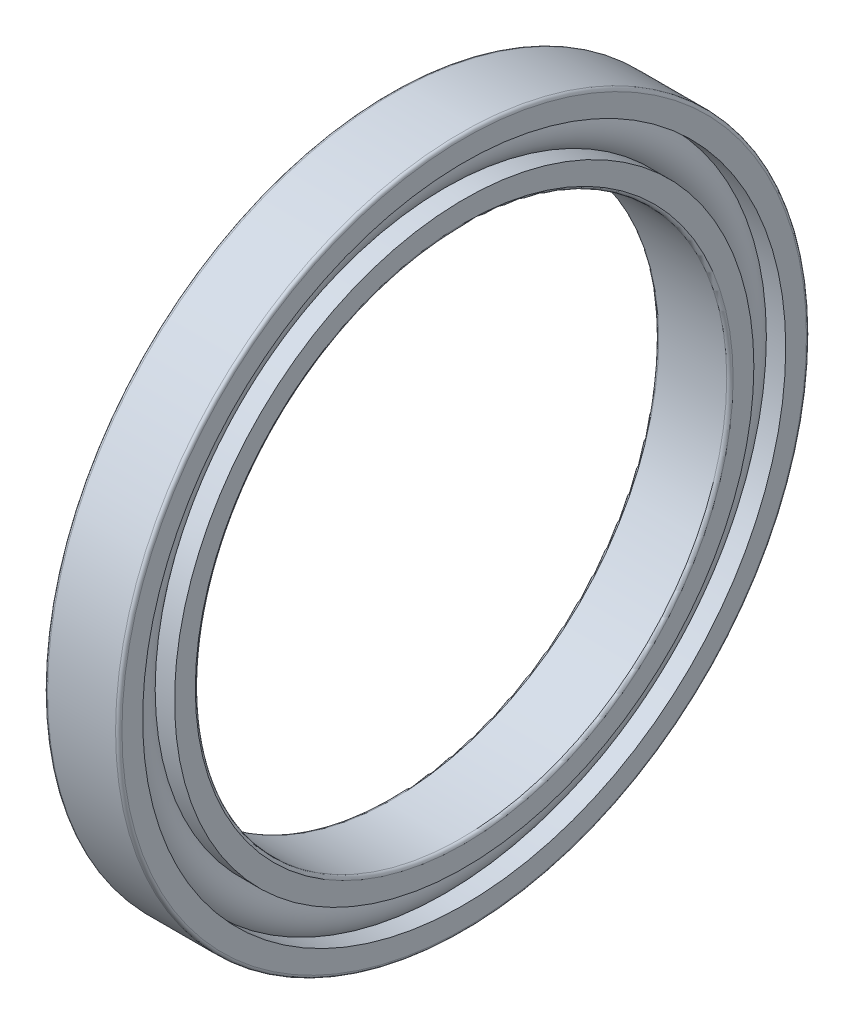
ISO-10303-21;
HEADER;
FILE_DESCRIPTION(('STEP AP214'),'2;1');
FILE_NAME('part.step','',(''),(''),'','','');
FILE_SCHEMA(('AUTOMOTIVE_DESIGN { 1 0 10303 214 1 1 1 1 }'));
ENDSEC;
DATA;
#1=APPLICATION_CONTEXT('core data for automotive mechanical design processes');
#2=APPLICATION_PROTOCOL_DEFINITION('international standard','automotive_design',2000,#1);
#3=PRODUCT_CONTEXT('',#1,'mechanical');
#4=PRODUCT('Part','Part','',(#3));
#5=PRODUCT_RELATED_PRODUCT_CATEGORY('part','',(#4));
#6=PRODUCT_DEFINITION_FORMATION('','',#4);
#7=PRODUCT_DEFINITION_CONTEXT('part definition',#1,'design');
#8=PRODUCT_DEFINITION('design','',#6,#7);
#9=PRODUCT_DEFINITION_SHAPE('','',#8);
#10=(LENGTH_UNIT() NAMED_UNIT(*) SI_UNIT(.MILLI.,.METRE.));
#11=(NAMED_UNIT(*) PLANE_ANGLE_UNIT() SI_UNIT($,.RADIAN.));
#12=(NAMED_UNIT(*) SI_UNIT($,.STERADIAN.) SOLID_ANGLE_UNIT());
#13=UNCERTAINTY_MEASURE_WITH_UNIT(LENGTH_MEASURE(1.E-05),#10,'distance_accuracy_value','');
#14=(GEOMETRIC_REPRESENTATION_CONTEXT(3) GLOBAL_UNCERTAINTY_ASSIGNED_CONTEXT((#13)) GLOBAL_UNIT_ASSIGNED_CONTEXT((#10,
#11,#12)) REPRESENTATION_CONTEXT('',''));
#15=CARTESIAN_POINT('',(0.,0.,0.));
#16=DIRECTION('',(0.,0.,1.));
#17=DIRECTION('',(1.,0.,0.));
#18=AXIS2_PLACEMENT_3D('',#15,#16,#17);
#19=CARTESIAN_POINT('',(0.,0.,0.));
#20=DIRECTION('',(-1.,0.,0.));
#21=DIRECTION('',(0.,0.,1.));
#22=AXIS2_PLACEMENT_3D('',#19,#20,#21);
#23=TOROIDAL_SURFACE('',#22,28.75,2.25);
#24=CARTESIAN_POINT('',(1.67705098312484,0.,0.));
#25=DIRECTION('',(-1.,0.,0.));
#26=DIRECTION('',(0.,0.,1.));
#27=AXIS2_PLACEMENT_3D('',#24,#25,#26);
#28=CIRCLE('',#27,30.25);
#29=CARTESIAN_POINT('',(1.67705098312484,0.,30.25));
#30=VERTEX_POINT('',#29);
#31=EDGE_CURVE('E35',#30,#30,#28,.F.);
#32=ORIENTED_EDGE('',*,*,#31,.T.);
#33=EDGE_LOOP('',(#32));
#34=FACE_BOUND('',#33,.T.);
#35=CARTESIAN_POINT('',(1.67705098312484,0.,0.));
#36=DIRECTION('',(-1.,0.,0.));
#37=DIRECTION('',(0.,0.,1.));
#38=AXIS2_PLACEMENT_3D('',#35,#36,#37);
#39=CIRCLE('',#38,27.25);
#40=CARTESIAN_POINT('',(1.67705098312484,0.,27.25));
#41=VERTEX_POINT('',#40);
#42=EDGE_CURVE('E10',#41,#41,#39,.T.);
#43=ORIENTED_EDGE('',*,*,#42,.T.);
#44=EDGE_LOOP('',(#43));
#45=FACE_BOUND('',#44,.T.);
#46=ADVANCED_FACE('F31',(#34,#45),#23,.T.);
#47=CARTESIAN_POINT('',(-20.6375,0.,0.));
#48=DIRECTION('',(1.,0.,0.));
#49=DIRECTION('',(0.,0.,-1.));
#50=AXIS2_PLACEMENT_3D('',#47,#48,#49);
#51=CYLINDRICAL_SURFACE('',#50,27.25);
#52=CARTESIAN_POINT('',(3.5,0.,0.));
#53=DIRECTION('',(1.,0.,0.));
#54=DIRECTION('',(0.,0.,-1.));
#55=AXIS2_PLACEMENT_3D('',#52,#53,#54);
#56=CIRCLE('',#55,27.25);
#57=CARTESIAN_POINT('',(3.5,0.,-27.25));
#58=VERTEX_POINT('',#57);
#59=EDGE_CURVE('E44',#58,#58,#56,.T.);
#60=ORIENTED_EDGE('',*,*,#59,.F.);
#61=EDGE_LOOP('',(#60));
#62=FACE_BOUND('',#61,.T.);
#63=ORIENTED_EDGE('',*,*,#42,.F.);
#64=EDGE_LOOP('',(#63));
#65=FACE_BOUND('',#64,.T.);
#66=ADVANCED_FACE('F83',(#62,#65),#51,.T.);
#67=CARTESIAN_POINT('',(-20.6375,0.,0.));
#68=DIRECTION('',(1.,0.,0.));
#69=DIRECTION('',(0.,0.,-1.));
#70=AXIS2_PLACEMENT_3D('',#67,#68,#69);
#71=CYLINDRICAL_SURFACE('',#70,27.25);
#72=CARTESIAN_POINT('',(-3.5,0.,0.));
#73=DIRECTION('',(1.,0.,0.));
#74=DIRECTION('',(0.,0.,-1.));
#75=AXIS2_PLACEMENT_3D('',#72,#73,#74);
#76=CIRCLE('',#75,27.25);
#77=CARTESIAN_POINT('',(-3.5,0.,-27.25));
#78=VERTEX_POINT('',#77);
#79=EDGE_CURVE('E53',#78,#78,#76,.T.);
#80=ORIENTED_EDGE('',*,*,#79,.T.);
#81=EDGE_LOOP('',(#80));
#82=FACE_BOUND('',#81,.T.);
#83=CARTESIAN_POINT('',(-1.67705098312484,0.,0.));
#84=DIRECTION('',(1.,0.,0.));
#85=DIRECTION('',(0.,0.,-1.));
#86=AXIS2_PLACEMENT_3D('',#83,#84,#85);
#87=CIRCLE('',#86,27.25);
#88=CARTESIAN_POINT('',(-1.67705098312484,0.,-27.25));
#89=VERTEX_POINT('',#88);
#90=EDGE_CURVE('E39',#89,#89,#87,.T.);
#91=ORIENTED_EDGE('',*,*,#90,.F.);
#92=EDGE_LOOP('',(#91));
#93=FACE_BOUND('',#92,.T.);
#94=ADVANCED_FACE('F86',(#82,#93),#71,.T.);
#95=CARTESIAN_POINT('',(3.5,25.3,0.));
#96=DIRECTION('',(1.,0.,0.));
#97=DIRECTION('',(0.,0.,-1.));
#98=AXIS2_PLACEMENT_3D('',#95,#96,#97);
#99=PLANE('',#98);
#100=ORIENTED_EDGE('',*,*,#59,.T.);
#101=EDGE_LOOP('',(#100));
#102=FACE_BOUND('',#101,.T.);
#103=CARTESIAN_POINT('',(3.5,0.,0.));
#104=DIRECTION('',(1.,0.,0.));
#105=DIRECTION('',(0.,0.,-1.));
#106=AXIS2_PLACEMENT_3D('',#103,#104,#105);
#107=CIRCLE('',#106,25.3);
#108=CARTESIAN_POINT('',(3.5,0.,-25.3));
#109=VERTEX_POINT('',#108);
#110=EDGE_CURVE('E75',#109,#109,#107,.T.);
#111=ORIENTED_EDGE('',*,*,#110,.F.);
#112=EDGE_LOOP('',(#111));
#113=FACE_BOUND('',#112,.T.);
#114=ADVANCED_FACE('F80',(#102,#113),#99,.T.);
#115=CARTESIAN_POINT('',(3.2,0.,0.));
#116=DIRECTION('',(1.,0.,0.));
#117=DIRECTION('',(0.,0.,-1.));
#118=AXIS2_PLACEMENT_3D('',#115,#116,#117);
#119=TOROIDAL_SURFACE('',#118,25.3,0.300000000000001);
#120=ORIENTED_EDGE('',*,*,#110,.T.);
#121=EDGE_LOOP('',(#120));
#122=FACE_BOUND('',#121,.T.);
#123=CARTESIAN_POINT('',(3.2,0.,0.));
#124=DIRECTION('',(1.,0.,0.));
#125=DIRECTION('',(0.,0.,-1.));
#126=AXIS2_PLACEMENT_3D('',#123,#124,#125);
#127=CIRCLE('',#126,25.);
#128=CARTESIAN_POINT('',(3.2,0.,-25.));
#129=VERTEX_POINT('',#128);
#130=EDGE_CURVE('E72',#129,#129,#127,.T.);
#131=ORIENTED_EDGE('',*,*,#130,.F.);
#132=EDGE_LOOP('',(#131));
#133=FACE_BOUND('',#132,.T.);
#134=ADVANCED_FACE('F97',(#122,#133),#119,.T.);
#135=CARTESIAN_POINT('',(-20.6375,0.,0.));
#136=DIRECTION('',(1.,0.,0.));
#137=DIRECTION('',(0.,0.,-1.));
#138=AXIS2_PLACEMENT_3D('',#135,#136,#137);
#139=CYLINDRICAL_SURFACE('',#138,25.);
#140=ORIENTED_EDGE('',*,*,#130,.T.);
#141=EDGE_LOOP('',(#140));
#142=FACE_BOUND('',#141,.T.);
#143=CARTESIAN_POINT('',(-3.2,0.,0.));
#144=DIRECTION('',(1.,0.,0.));
#145=DIRECTION('',(0.,0.,-1.));
#146=AXIS2_PLACEMENT_3D('',#143,#144,#145);
#147=CIRCLE('',#146,25.);
#148=CARTESIAN_POINT('',(-3.2,0.,-25.));
#149=VERTEX_POINT('',#148);
#150=EDGE_CURVE('E69',#149,#149,#147,.T.);
#151=ORIENTED_EDGE('',*,*,#150,.F.);
#152=EDGE_LOOP('',(#151));
#153=FACE_BOUND('',#152,.T.);
#154=ADVANCED_FACE('F100',(#142,#153),#139,.F.);
#155=CARTESIAN_POINT('',(-3.2,0.,0.));
#156=DIRECTION('',(1.,0.,0.));
#157=DIRECTION('',(0.,0.,-1.));
#158=AXIS2_PLACEMENT_3D('',#155,#156,#157);
#159=TOROIDAL_SURFACE('',#158,25.3,0.300000000000001);
#160=ORIENTED_EDGE('',*,*,#150,.T.);
#161=EDGE_LOOP('',(#160));
#162=FACE_BOUND('',#161,.T.);
#163=CARTESIAN_POINT('',(-3.5,0.,0.));
#164=DIRECTION('',(1.,0.,0.));
#165=DIRECTION('',(0.,0.,-1.));
#166=AXIS2_PLACEMENT_3D('',#163,#164,#165);
#167=CIRCLE('',#166,25.3);
#168=CARTESIAN_POINT('',(-3.5,0.,-25.3));
#169=VERTEX_POINT('',#168);
#170=EDGE_CURVE('E66',#169,#169,#167,.T.);
#171=ORIENTED_EDGE('',*,*,#170,.F.);
#172=EDGE_LOOP('',(#171));
#173=FACE_BOUND('',#172,.T.);
#174=ADVANCED_FACE('F104',(#162,#173),#159,.T.);
#175=CARTESIAN_POINT('',(-3.5,27.25,0.));
#176=DIRECTION('',(-1.,0.,0.));
#177=DIRECTION('',(0.,0.,1.));
#178=AXIS2_PLACEMENT_3D('',#175,#176,#177);
#179=PLANE('',#178);
#180=ORIENTED_EDGE('',*,*,#170,.T.);
#181=EDGE_LOOP('',(#180));
#182=FACE_BOUND('',#181,.T.);
#183=ORIENTED_EDGE('',*,*,#79,.F.);
#184=EDGE_LOOP('',(#183));
#185=FACE_BOUND('',#184,.T.);
#186=ADVANCED_FACE('F108',(#182,#185),#179,.T.);
#187=CARTESIAN_POINT('',(-1.67705098312484,0.,0.));
#188=DIRECTION('',(1.,0.,0.));
#189=DIRECTION('',(0.,0.,-1.));
#190=AXIS2_PLACEMENT_3D('',#187,#188,#189);
#191=CIRCLE('',#190,30.25);
#192=CARTESIAN_POINT('',(-1.67705098312484,0.,-30.25));
#193=VERTEX_POINT('',#192);
#194=EDGE_CURVE('E47',#193,#193,#191,.F.);
#195=ORIENTED_EDGE('',*,*,#194,.T.);
#196=EDGE_LOOP('',(#195));
#197=FACE_BOUND('',#196,.T.);
#198=ORIENTED_EDGE('',*,*,#90,.T.);
#199=EDGE_LOOP('',(#198));
#200=FACE_BOUND('',#199,.T.);
#201=ADVANCED_FACE('F33',(#197,#200),#23,.T.);
#202=CARTESIAN_POINT('',(-20.6375,0.,0.));
#203=DIRECTION('',(1.,0.,0.));
#204=DIRECTION('',(0.,0.,-1.));
#205=AXIS2_PLACEMENT_3D('',#202,#203,#204);
#206=CYLINDRICAL_SURFACE('',#205,30.25);
#207=CARTESIAN_POINT('',(3.5,0.,0.));
#208=DIRECTION('',(1.,0.,0.));
#209=DIRECTION('',(0.,0.,-1.));
#210=AXIS2_PLACEMENT_3D('',#207,#208,#209);
#211=CIRCLE('',#210,30.25);
#212=CARTESIAN_POINT('',(3.5,0.,-30.25));
#213=VERTEX_POINT('',#212);
#214=EDGE_CURVE('E49',#213,#213,#211,.T.);
#215=ORIENTED_EDGE('',*,*,#214,.T.);
#216=EDGE_LOOP('',(#215));
#217=FACE_BOUND('',#216,.T.);
#218=ORIENTED_EDGE('',*,*,#31,.F.);
#219=EDGE_LOOP('',(#218));
#220=FACE_BOUND('',#219,.T.);
#221=ADVANCED_FACE('F113',(#217,#220),#206,.F.);
#222=CARTESIAN_POINT('',(-20.6375,0.,0.));
#223=DIRECTION('',(1.,0.,0.));
#224=DIRECTION('',(0.,0.,-1.));
#225=AXIS2_PLACEMENT_3D('',#222,#223,#224);
#226=CYLINDRICAL_SURFACE('',#225,30.25);
#227=CARTESIAN_POINT('',(-3.5,0.,0.));
#228=DIRECTION('',(1.,0.,0.));
#229=DIRECTION('',(0.,0.,-1.));
#230=AXIS2_PLACEMENT_3D('',#227,#228,#229);
#231=CIRCLE('',#230,30.25);
#232=CARTESIAN_POINT('',(-3.5,0.,-30.25));
#233=VERTEX_POINT('',#232);
#234=EDGE_CURVE('E144',#233,#233,#231,.T.);
#235=ORIENTED_EDGE('',*,*,#234,.F.);
#236=EDGE_LOOP('',(#235));
#237=FACE_BOUND('',#236,.T.);
#238=ORIENTED_EDGE('',*,*,#194,.F.);
#239=EDGE_LOOP('',(#238));
#240=FACE_BOUND('',#239,.T.);
#241=ADVANCED_FACE('F116',(#237,#240),#226,.F.);
#242=CARTESIAN_POINT('',(3.5,32.2,0.));
#243=DIRECTION('',(1.,0.,0.));
#244=DIRECTION('',(0.,0.,-1.));
#245=AXIS2_PLACEMENT_3D('',#242,#243,#244);
#246=PLANE('',#245);
#247=CARTESIAN_POINT('',(3.5,0.,0.));
#248=DIRECTION('',(1.,0.,0.));
#249=DIRECTION('',(0.,0.,-1.));
#250=AXIS2_PLACEMENT_3D('',#247,#248,#249);
#251=CIRCLE('',#250,32.2);
#252=CARTESIAN_POINT('',(3.5,0.,-32.2));
#253=VERTEX_POINT('',#252);
#254=EDGE_CURVE('E55',#253,#253,#251,.T.);
#255=ORIENTED_EDGE('',*,*,#254,.T.);
#256=EDGE_LOOP('',(#255));
#257=FACE_BOUND('',#256,.T.);
#258=ORIENTED_EDGE('',*,*,#214,.F.);
#259=EDGE_LOOP('',(#258));
#260=FACE_BOUND('',#259,.T.);
#261=ADVANCED_FACE('F117',(#257,#260),#246,.T.);
#262=CARTESIAN_POINT('',(3.2,0.,0.));
#263=DIRECTION('',(1.,0.,0.));
#264=DIRECTION('',(0.,0.,-1.));
#265=AXIS2_PLACEMENT_3D('',#262,#263,#264);
#266=TOROIDAL_SURFACE('',#265,32.2,0.299999999999997);
#267=CARTESIAN_POINT('',(3.2,0.,0.));
#268=DIRECTION('',(1.,0.,0.));
#269=DIRECTION('',(0.,0.,-1.));
#270=AXIS2_PLACEMENT_3D('',#267,#268,#269);
#271=CIRCLE('',#270,32.5);
#272=CARTESIAN_POINT('',(3.2,0.,-32.5));
#273=VERTEX_POINT('',#272);
#274=EDGE_CURVE('E60',#273,#273,#271,.T.);
#275=ORIENTED_EDGE('',*,*,#274,.T.);
#276=EDGE_LOOP('',(#275));
#277=FACE_BOUND('',#276,.T.);
#278=ORIENTED_EDGE('',*,*,#254,.F.);
#279=EDGE_LOOP('',(#278));
#280=FACE_BOUND('',#279,.T.);
#281=ADVANCED_FACE('F120',(#277,#280),#266,.T.);
#282=CARTESIAN_POINT('',(-20.6375,0.,0.));
#283=DIRECTION('',(1.,0.,0.));
#284=DIRECTION('',(0.,0.,-1.));
#285=AXIS2_PLACEMENT_3D('',#282,#283,#284);
#286=CYLINDRICAL_SURFACE('',#285,32.5);
#287=CARTESIAN_POINT('',(-3.2,0.,0.));
#288=DIRECTION('',(1.,0.,0.));
#289=DIRECTION('',(0.,0.,-1.));
#290=AXIS2_PLACEMENT_3D('',#287,#288,#289);
#291=CIRCLE('',#290,32.5);
#292=CARTESIAN_POINT('',(-3.2,0.,-32.5));
#293=VERTEX_POINT('',#292);
#294=EDGE_CURVE('E148',#293,#293,#291,.T.);
#295=ORIENTED_EDGE('',*,*,#294,.T.);
#296=EDGE_LOOP('',(#295));
#297=FACE_BOUND('',#296,.T.);
#298=ORIENTED_EDGE('',*,*,#274,.F.);
#299=EDGE_LOOP('',(#298));
#300=FACE_BOUND('',#299,.T.);
#301=ADVANCED_FACE('F124',(#297,#300),#286,.T.);
#302=CARTESIAN_POINT('',(-3.2,0.,0.));
#303=DIRECTION('',(1.,0.,0.));
#304=DIRECTION('',(0.,0.,-1.));
#305=AXIS2_PLACEMENT_3D('',#302,#303,#304);
#306=TOROIDAL_SURFACE('',#305,32.2,0.299999999999997);
#307=CARTESIAN_POINT('',(-3.5,0.,0.));
#308=DIRECTION('',(1.,0.,0.));
#309=DIRECTION('',(0.,0.,-1.));
#310=AXIS2_PLACEMENT_3D('',#307,#308,#309);
#311=CIRCLE('',#310,32.2);
#312=CARTESIAN_POINT('',(-3.5,0.,-32.2));
#313=VERTEX_POINT('',#312);
#314=EDGE_CURVE('E145',#313,#313,#311,.T.);
#315=ORIENTED_EDGE('',*,*,#314,.T.);
#316=EDGE_LOOP('',(#315));
#317=FACE_BOUND('',#316,.T.);
#318=ORIENTED_EDGE('',*,*,#294,.F.);
#319=EDGE_LOOP('',(#318));
#320=FACE_BOUND('',#319,.T.);
#321=ADVANCED_FACE('F128',(#317,#320),#306,.T.);
#322=CARTESIAN_POINT('',(-3.5,30.25,0.));
#323=DIRECTION('',(-1.,0.,0.));
#324=DIRECTION('',(0.,0.,1.));
#325=AXIS2_PLACEMENT_3D('',#322,#323,#324);
#326=PLANE('',#325);
#327=ORIENTED_EDGE('',*,*,#234,.T.);
#328=EDGE_LOOP('',(#327));
#329=FACE_BOUND('',#328,.T.);
#330=ORIENTED_EDGE('',*,*,#314,.F.);
#331=EDGE_LOOP('',(#330));
#332=FACE_BOUND('',#331,.T.);
#333=ADVANCED_FACE('F132',(#329,#332),#326,.T.);
#334=CLOSED_SHELL('',(#46,#66,#94,#114,#134,#154,#174,#186,#201,#221,#241,#261,#281,#301,#321,#333));
#335=MANIFOLD_SOLID_BREP('B2',#334);
#336=ADVANCED_BREP_SHAPE_REPRESENTATION('',(#18,#335),#14);
#337=SHAPE_DEFINITION_REPRESENTATION(#9,#336);
ENDSEC;
END-ISO-10303-21;
